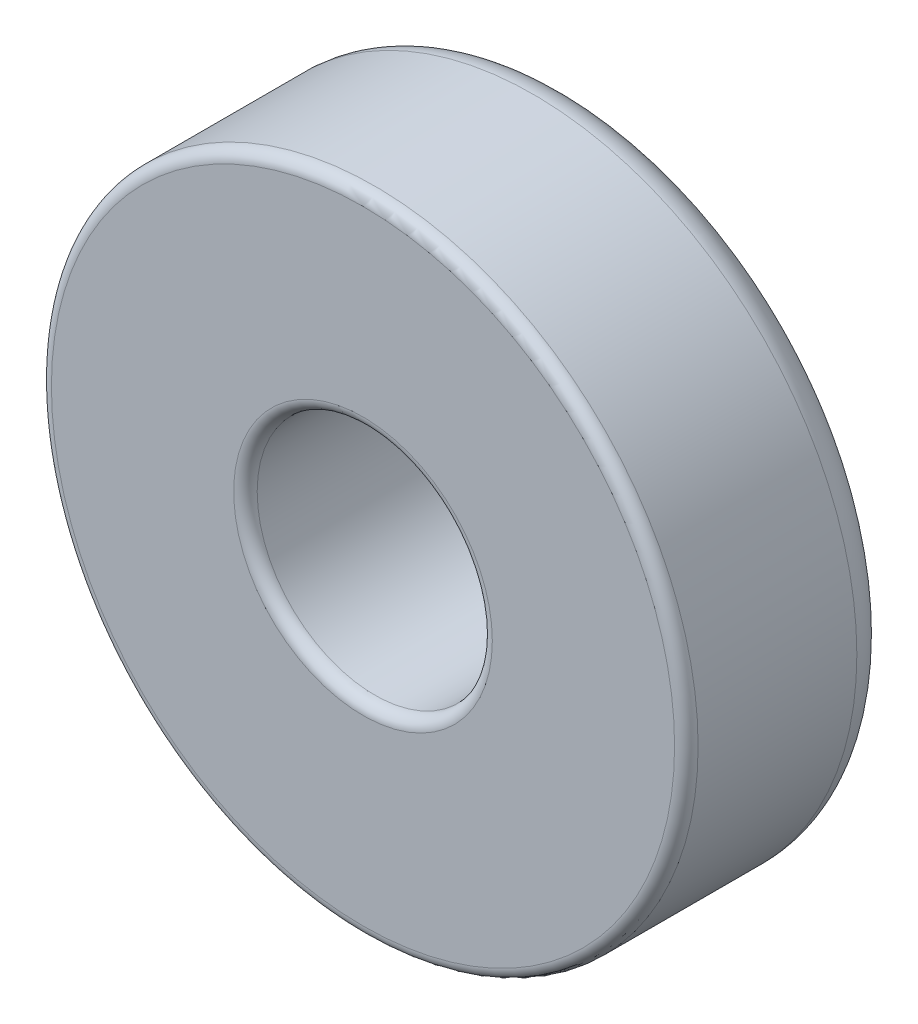
ISO-10303-21;
HEADER;
FILE_DESCRIPTION(('STEP AP214'),'2;1');
FILE_NAME('part.step','',(''),(''),'','','');
FILE_SCHEMA(('AUTOMOTIVE_DESIGN { 1 0 10303 214 1 1 1 1 }'));
ENDSEC;
DATA;
#1=APPLICATION_CONTEXT('core data for automotive mechanical design processes');
#2=APPLICATION_PROTOCOL_DEFINITION('international standard','automotive_design',2000,#1);
#3=PRODUCT_CONTEXT('',#1,'mechanical');
#4=PRODUCT('Part','Part','',(#3));
#5=PRODUCT_RELATED_PRODUCT_CATEGORY('part','',(#4));
#6=PRODUCT_DEFINITION_FORMATION('','',#4);
#7=PRODUCT_DEFINITION_CONTEXT('part definition',#1,'design');
#8=PRODUCT_DEFINITION('design','',#6,#7);
#9=PRODUCT_DEFINITION_SHAPE('','',#8);
#10=(LENGTH_UNIT() NAMED_UNIT(*) SI_UNIT(.MILLI.,.METRE.));
#11=(NAMED_UNIT(*) PLANE_ANGLE_UNIT() SI_UNIT($,.RADIAN.));
#12=(NAMED_UNIT(*) SI_UNIT($,.STERADIAN.) SOLID_ANGLE_UNIT());
#13=UNCERTAINTY_MEASURE_WITH_UNIT(LENGTH_MEASURE(1.E-05),#10,'distance_accuracy_value','');
#14=(GEOMETRIC_REPRESENTATION_CONTEXT(3) GLOBAL_UNCERTAINTY_ASSIGNED_CONTEXT((#13)) GLOBAL_UNIT_ASSIGNED_CONTEXT((#10,
#11,#12)) REPRESENTATION_CONTEXT('',''));
#15=CARTESIAN_POINT('',(0.,0.,0.));
#16=DIRECTION('',(0.,0.,1.));
#17=DIRECTION('',(1.,0.,0.));
#18=AXIS2_PLACEMENT_3D('',#15,#16,#17);
#19=CARTESIAN_POINT('',(0.,0.,1.75));
#20=DIRECTION('',(0.,0.,1.));
#21=DIRECTION('',(1.,0.,0.));
#22=AXIS2_PLACEMENT_3D('',#19,#20,#21);
#23=PLANE('',#22);
#24=CARTESIAN_POINT('',(0.,0.,1.75));
#25=DIRECTION('',(0.,0.,1.));
#26=DIRECTION('',(1.,0.,0.));
#27=AXIS2_PLACEMENT_3D('',#24,#25,#26);
#28=CIRCLE('',#27,1.1);
#29=CARTESIAN_POINT('',(1.1,0.,1.75));
#30=VERTEX_POINT('',#29);
#31=EDGE_CURVE('E51',#30,#30,#28,.F.);
#32=ORIENTED_EDGE('',*,*,#31,.T.);
#33=EDGE_LOOP('',(#32));
#34=FACE_BOUND('',#33,.T.);
#35=CARTESIAN_POINT('',(0.,0.,1.75));
#36=DIRECTION('',(0.,0.,1.));
#37=DIRECTION('',(1.,0.,0.));
#38=AXIS2_PLACEMENT_3D('',#35,#36,#37);
#39=CIRCLE('',#38,2.65);
#40=CARTESIAN_POINT('',(2.65,0.,1.75));
#41=VERTEX_POINT('',#40);
#42=EDGE_CURVE('E56',#41,#41,#39,.T.);
#43=ORIENTED_EDGE('',*,*,#42,.T.);
#44=EDGE_LOOP('',(#43));
#45=FACE_BOUND('',#44,.T.);
#46=ADVANCED_FACE('F43',(#34,#45),#23,.T.);
#47=CARTESIAN_POINT('',(0.,0.,0.));
#48=DIRECTION('',(0.,0.,1.));
#49=DIRECTION('',(1.,0.,0.));
#50=AXIS2_PLACEMENT_3D('',#47,#48,#49);
#51=PLANE('',#50);
#52=CARTESIAN_POINT('',(0.,0.,0.));
#53=DIRECTION('',(0.,0.,1.));
#54=DIRECTION('',(1.,0.,0.));
#55=AXIS2_PLACEMENT_3D('',#52,#53,#54);
#56=CIRCLE('',#55,1.1);
#57=CARTESIAN_POINT('',(1.1,0.,0.));
#58=VERTEX_POINT('',#57);
#59=EDGE_CURVE('E71',#58,#58,#56,.T.);
#60=ORIENTED_EDGE('',*,*,#59,.T.);
#61=EDGE_LOOP('',(#60));
#62=FACE_BOUND('',#61,.T.);
#63=CARTESIAN_POINT('',(0.,0.,0.));
#64=DIRECTION('',(0.,0.,1.));
#65=DIRECTION('',(1.,0.,0.));
#66=AXIS2_PLACEMENT_3D('',#63,#64,#65);
#67=CIRCLE('',#66,2.45);
#68=CARTESIAN_POINT('',(2.45,0.,0.));
#69=VERTEX_POINT('',#68);
#70=EDGE_CURVE('E75',#69,#69,#67,.F.);
#71=ORIENTED_EDGE('',*,*,#70,.T.);
#72=EDGE_LOOP('',(#71));
#73=FACE_BOUND('',#72,.T.);
#74=ADVANCED_FACE('F104',(#62,#73),#51,.F.);
#75=CARTESIAN_POINT('',(0.,0.,1.75));
#76=DIRECTION('',(0.,0.,-1.));
#77=DIRECTION('',(-1.,0.,0.));
#78=AXIS2_PLACEMENT_3D('',#75,#76,#77);
#79=CYLINDRICAL_SURFACE('',#78,2.75);
#80=CARTESIAN_POINT('',(0.,0.,1.65));
#81=DIRECTION('',(0.,0.,1.));
#82=DIRECTION('',(1.,0.,0.));
#83=AXIS2_PLACEMENT_3D('',#80,#81,#82);
#84=CIRCLE('',#83,2.75);
#85=CARTESIAN_POINT('',(2.75,0.,1.65));
#86=VERTEX_POINT('',#85);
#87=EDGE_CURVE('E11',#86,#86,#84,.F.);
#88=ORIENTED_EDGE('',*,*,#87,.T.);
#89=EDGE_LOOP('',(#88));
#90=FACE_BOUND('',#89,.T.);
#91=CARTESIAN_POINT('',(0.,0.,0.3));
#92=DIRECTION('',(0.,0.,1.));
#93=DIRECTION('',(1.,0.,0.));
#94=AXIS2_PLACEMENT_3D('',#91,#92,#93);
#95=CIRCLE('',#94,2.75);
#96=CARTESIAN_POINT('',(2.75,0.,0.3));
#97=VERTEX_POINT('',#96);
#98=EDGE_CURVE('E79',#97,#97,#95,.T.);
#99=ORIENTED_EDGE('',*,*,#98,.T.);
#100=EDGE_LOOP('',(#99));
#101=FACE_BOUND('',#100,.T.);
#102=ADVANCED_FACE('F84',(#90,#101),#79,.T.);
#103=CARTESIAN_POINT('',(0.,0.,1.75));
#104=DIRECTION('',(0.,0.,-1.));
#105=DIRECTION('',(-1.,0.,0.));
#106=AXIS2_PLACEMENT_3D('',#103,#104,#105);
#107=CYLINDRICAL_SURFACE('',#106,1.);
#108=CARTESIAN_POINT('',(0.,0.,0.1));
#109=DIRECTION('',(0.,0.,1.));
#110=DIRECTION('',(1.,0.,0.));
#111=AXIS2_PLACEMENT_3D('',#108,#109,#110);
#112=CIRCLE('',#111,1.);
#113=CARTESIAN_POINT('',(1.,0.,0.1));
#114=VERTEX_POINT('',#113);
#115=EDGE_CURVE('E61',#114,#114,#112,.F.);
#116=ORIENTED_EDGE('',*,*,#115,.T.);
#117=EDGE_LOOP('',(#116));
#118=FACE_BOUND('',#117,.T.);
#119=CARTESIAN_POINT('',(0.,0.,1.65));
#120=DIRECTION('',(0.,0.,1.));
#121=DIRECTION('',(1.,0.,0.));
#122=AXIS2_PLACEMENT_3D('',#119,#120,#121);
#123=CIRCLE('',#122,1.);
#124=CARTESIAN_POINT('',(1.,0.,1.65));
#125=VERTEX_POINT('',#124);
#126=EDGE_CURVE('E67',#125,#125,#123,.T.);
#127=ORIENTED_EDGE('',*,*,#126,.T.);
#128=EDGE_LOOP('',(#127));
#129=FACE_BOUND('',#128,.T.);
#130=ADVANCED_FACE('F89',(#118,#129),#107,.F.);
#131=CARTESIAN_POINT('',(0.,0.,0.3));
#132=DIRECTION('',(0.,0.,1.));
#133=DIRECTION('',(1.,0.,0.));
#134=AXIS2_PLACEMENT_3D('',#131,#132,#133);
#135=TOROIDAL_SURFACE('',#134,2.45,0.3);
#136=ORIENTED_EDGE('',*,*,#70,.F.);
#137=EDGE_LOOP('',(#136));
#138=FACE_BOUND('',#137,.T.);
#139=ORIENTED_EDGE('',*,*,#98,.F.);
#140=EDGE_LOOP('',(#139));
#141=FACE_BOUND('',#140,.T.);
#142=ADVANCED_FACE('F86',(#138,#141),#135,.T.);
#143=CARTESIAN_POINT('',(0.,0.,0.1));
#144=DIRECTION('',(0.,0.,1.));
#145=DIRECTION('',(1.,0.,0.));
#146=AXIS2_PLACEMENT_3D('',#143,#144,#145);
#147=TOROIDAL_SURFACE('',#146,1.1,0.1);
#148=ORIENTED_EDGE('',*,*,#115,.F.);
#149=EDGE_LOOP('',(#148));
#150=FACE_BOUND('',#149,.T.);
#151=ORIENTED_EDGE('',*,*,#59,.F.);
#152=EDGE_LOOP('',(#151));
#153=FACE_BOUND('',#152,.T.);
#154=ADVANCED_FACE('F88',(#150,#153),#147,.T.);
#155=CARTESIAN_POINT('',(0.,0.,1.65));
#156=DIRECTION('',(0.,0.,1.));
#157=DIRECTION('',(1.,0.,0.));
#158=AXIS2_PLACEMENT_3D('',#155,#156,#157);
#159=TOROIDAL_SURFACE('',#158,1.1,0.1);
#160=ORIENTED_EDGE('',*,*,#31,.F.);
#161=EDGE_LOOP('',(#160));
#162=FACE_BOUND('',#161,.T.);
#163=ORIENTED_EDGE('',*,*,#126,.F.);
#164=EDGE_LOOP('',(#163));
#165=FACE_BOUND('',#164,.T.);
#166=ADVANCED_FACE('F96',(#162,#165),#159,.T.);
#167=CARTESIAN_POINT('',(0.,0.,1.65));
#168=DIRECTION('',(0.,0.,1.));
#169=DIRECTION('',(1.,0.,0.));
#170=AXIS2_PLACEMENT_3D('',#167,#168,#169);
#171=TOROIDAL_SURFACE('',#170,2.65,0.1);
#172=ORIENTED_EDGE('',*,*,#87,.F.);
#173=EDGE_LOOP('',(#172));
#174=FACE_BOUND('',#173,.T.);
#175=ORIENTED_EDGE('',*,*,#42,.F.);
#176=EDGE_LOOP('',(#175));
#177=FACE_BOUND('',#176,.T.);
#178=ADVANCED_FACE('F45',(#174,#177),#171,.T.);
#179=CLOSED_SHELL('',(#46,#74,#102,#130,#142,#154,#166,#178));
#180=MANIFOLD_SOLID_BREP('B2',#179);
#181=ADVANCED_BREP_SHAPE_REPRESENTATION('',(#18,#180),#14);
#182=SHAPE_DEFINITION_REPRESENTATION(#9,#181);
ENDSEC;
END-ISO-10303-21;
